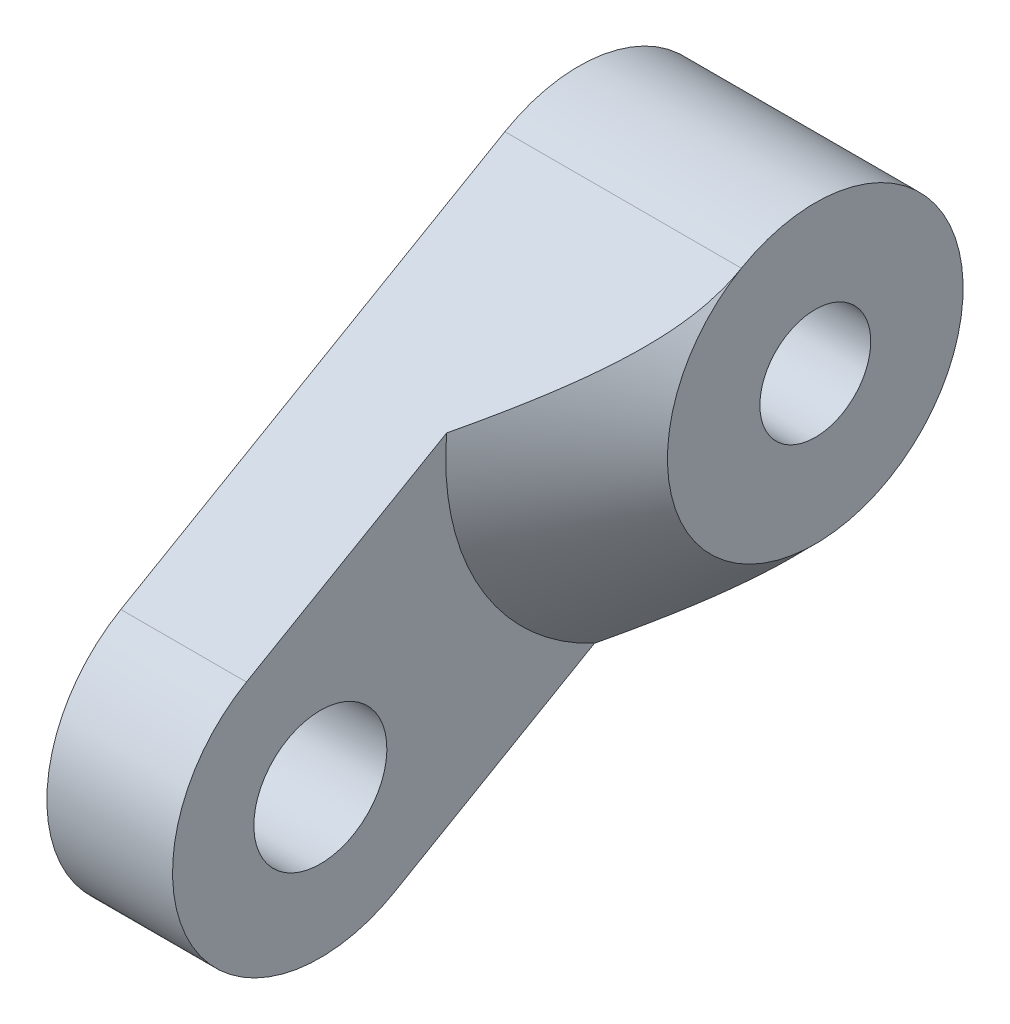
ISO-10303-21;
HEADER;
FILE_DESCRIPTION(('STEP AP214'),'2;1');
FILE_NAME('part.step','',(''),(''),'','','');
FILE_SCHEMA(('AUTOMOTIVE_DESIGN { 1 0 10303 214 1 1 1 1 }'));
ENDSEC;
DATA;
#1=APPLICATION_CONTEXT('core data for automotive mechanical design processes');
#2=APPLICATION_PROTOCOL_DEFINITION('international standard','automotive_design',2000,#1);
#3=PRODUCT_CONTEXT('',#1,'mechanical');
#4=PRODUCT('Part','Part','',(#3));
#5=PRODUCT_RELATED_PRODUCT_CATEGORY('part','',(#4));
#6=PRODUCT_DEFINITION_FORMATION('','',#4);
#7=PRODUCT_DEFINITION_CONTEXT('part definition',#1,'design');
#8=PRODUCT_DEFINITION('design','',#6,#7);
#9=PRODUCT_DEFINITION_SHAPE('','',#8);
#10=(LENGTH_UNIT() NAMED_UNIT(*) SI_UNIT(.MILLI.,.METRE.));
#11=(NAMED_UNIT(*) PLANE_ANGLE_UNIT() SI_UNIT($,.RADIAN.));
#12=(NAMED_UNIT(*) SI_UNIT($,.STERADIAN.) SOLID_ANGLE_UNIT());
#13=UNCERTAINTY_MEASURE_WITH_UNIT(LENGTH_MEASURE(1.E-05),#10,'distance_accuracy_value','');
#14=(GEOMETRIC_REPRESENTATION_CONTEXT(3) GLOBAL_UNCERTAINTY_ASSIGNED_CONTEXT((#13)) GLOBAL_UNIT_ASSIGNED_CONTEXT((#10,
#11,#12)) REPRESENTATION_CONTEXT('',''));
#15=CARTESIAN_POINT('',(0.,0.,0.));
#16=DIRECTION('',(0.,0.,1.));
#17=DIRECTION('',(1.,0.,0.));
#18=AXIS2_PLACEMENT_3D('',#15,#16,#17);
#19=CARTESIAN_POINT('',(4.15,-6.46410161513776,3.19615242270664));
#20=DIRECTION('',(0.,-0.866025403784439,-0.5));
#21=DIRECTION('',(0.,0.5,-0.866025403784439));
#22=AXIS2_PLACEMENT_3D('',#19,#20,#21);
#23=PLANE('',#22);
#24=DIRECTION('',(0.,-0.5,0.866025403784439));
#25=VECTOR('',#24,1.);
#26=CARTESIAN_POINT('',(0.75,-6.46410161513776,3.19615242270664));
#27=LINE('',#26,#25);
#28=CARTESIAN_POINT('',(0.75,-3.46410161513776,-2.));
#29=VERTEX_POINT('',#28);
#30=CARTESIAN_POINT('',(0.75,-9.46410161513775,8.39230484541327));
#31=VERTEX_POINT('',#30);
#32=EDGE_CURVE('E11',#29,#31,#27,.T.);
#33=ORIENTED_EDGE('',*,*,#32,.F.);
#34=DIRECTION('',(-1.,0.,0.));
#35=VECTOR('',#34,1.);
#36=CARTESIAN_POINT('',(4.15,-3.46410161513776,-2.));
#37=LINE('',#36,#35);
#38=CARTESIAN_POINT('',(7.15,-3.46410161513776,-2.));
#39=VERTEX_POINT('',#38);
#40=EDGE_CURVE('E25',#39,#29,#37,.T.);
#41=ORIENTED_EDGE('',*,*,#40,.F.);
#42=CARTESIAN_POINT('',(7.15,-3.46410161513776,-2.));
#43=CARTESIAN_POINT('',(7.15000495558701,-3.49486623155934,-1.94671412128246));
#44=CARTESIAN_POINT('',(7.14857959002426,-3.52562633311852,-1.89343606253598));
#45=CARTESIAN_POINT('',(7.14291488089547,-3.58707676963033,-1.78700078435024));
#46=CARTESIAN_POINT('',(7.13867600090148,-3.61776711524062,-1.73384354645137));
#47=CARTESIAN_POINT('',(7.12183357584904,-3.70952021507166,-1.57492251579206));
#48=CARTESIAN_POINT('',(7.10510382359968,-3.77040355086952,-1.4694694848559));
#49=CARTESIAN_POINT('',(7.06191323144653,-3.89016145493996,-1.26204271039794));
#50=CARTESIAN_POINT('',(7.03563065290435,-3.94905249284434,-1.16004044063707));
#51=CARTESIAN_POINT('',(6.97446412150058,-4.06571972542516,-0.957966866228639));
#52=CARTESIAN_POINT('',(6.93957603775054,-4.12349537027677,-0.857896513905586));
#53=CARTESIAN_POINT('',(6.81652768533448,-4.30593558143131,-0.541900798842337));
#54=CARTESIAN_POINT('',(6.71442729580135,-4.42826623517251,-0.330017891239472));
#55=CARTESIAN_POINT('',(6.5436956635312,-4.60745875664494,-0.0196473397128512));
#56=CARTESIAN_POINT('',(6.48378050620427,-4.66653398272327,0.082673953323447));
#57=CARTESIAN_POINT('',(6.35912771552204,-4.78340401266141,0.285098783058402));
#58=CARTESIAN_POINT('',(6.29439065330274,-4.84119896711567,0.3852025805943));
#59=CARTESIAN_POINT('',(6.15989513709493,-4.95659006769358,0.585065829536538));
#60=CARTESIAN_POINT('',(6.09007104952281,-5.01416690086764,0.684791829932926));
#61=CARTESIAN_POINT('',(5.94710484213548,-5.12828424598705,0.88244886970462));
#62=CARTESIAN_POINT('',(5.87396247737422,-5.18482468099441,0.980379775819403));
#63=CARTESIAN_POINT('',(5.65060065042847,-5.35298919867628,1.27164926447472));
#64=CARTESIAN_POINT('',(5.49631952911267,-5.46326287669468,1.46264887754008));
#65=CARTESIAN_POINT('',(5.14679422688582,-5.70416210306856,1.87989857712368));
#66=CARTESIAN_POINT('',(4.94979960853262,-5.83414640959704,2.10503800021761));
#67=CARTESIAN_POINT('',(4.65084729316104,-6.02559965898364,2.43664475542935));
#68=CARTESIAN_POINT('',(4.55170066814463,-6.08817734829258,2.54503249273271));
#69=CARTESIAN_POINT('',(4.35191118363988,-6.21271644217646,2.76074053086817));
#70=CARTESIAN_POINT('',(4.2512685697867,-6.27467794519802,2.86806100221486));
#71=CARTESIAN_POINT('',(4.15,-6.33638293840677,2.9749371855331));
#72=B_SPLINE_CURVE_WITH_KNOTS('',3,(#42,#43,#44,#45,#46,#47,#48,#49,#50,#51,#52,#53,#54,#55,#56,
#57,#58,#59,#60,#61,#62,#63,#64,#65,#66,#67,#68,#69,#70,#71),.UNSPECIFIED.,.F.,.F.,(4,2,2,2,2,2,
2,2,2,2,2,2,2,2,4),(0.,0.184553945235247,0.36907748976712,0.737296607836383,1.09897043484959,
1.46081821466597,2.25385660127688,2.65123732944293,3.048571064019,3.45251679835832,
3.85649239952769,4.66370127089406,5.64202919472325,6.12102582375514,6.59994465376307),.UNSPECIFIED.);
#73=CARTESIAN_POINT('',(4.15,-6.33638293840677,2.9749371855331));
#74=VERTEX_POINT('',#73);
#75=EDGE_CURVE('E107',#39,#74,#72,.T.);
#76=ORIENTED_EDGE('',*,*,#75,.T.);
#77=DIRECTION('',(0.,-0.5,0.866025403784439));
#78=VECTOR('',#77,1.);
#79=CARTESIAN_POINT('',(4.15,-6.46410161513776,3.19615242270664));
#80=LINE('',#79,#78);
#81=CARTESIAN_POINT('',(4.15,-9.46410161513775,8.39230484541327));
#82=VERTEX_POINT('',#81);
#83=EDGE_CURVE('E76',#74,#82,#80,.T.);
#84=ORIENTED_EDGE('',*,*,#83,.T.);
#85=DIRECTION('',(-1.,0.,0.));
#86=VECTOR('',#85,1.);
#87=CARTESIAN_POINT('',(4.15,-9.46410161513775,8.39230484541327));
#88=LINE('',#87,#86);
#89=EDGE_CURVE('E128',#82,#31,#88,.T.);
#90=ORIENTED_EDGE('',*,*,#89,.T.);
#91=EDGE_LOOP('',(#33,#41,#76,#84,#90));
#92=FACE_BOUND('',#91,.T.);
#93=ADVANCED_FACE('F17',(#92),#23,.T.);
#94=CARTESIAN_POINT('',(4.15,0.,0.));
#95=DIRECTION('',(-1.,0.,0.));
#96=DIRECTION('',(0.,1.,0.));
#97=AXIS2_PLACEMENT_3D('',#94,#95,#96);
#98=CYLINDRICAL_SURFACE('',#97,4.);
#99=DIRECTION('',(-1.,0.,0.));
#100=VECTOR('',#99,1.);
#101=CARTESIAN_POINT('',(4.15,3.46410161513776,2.));
#102=LINE('',#101,#100);
#103=CARTESIAN_POINT('',(7.15,3.46410161513776,2.));
#104=VERTEX_POINT('',#103);
#105=CARTESIAN_POINT('',(0.75,3.46410161513776,2.));
#106=VERTEX_POINT('',#105);
#107=EDGE_CURVE('E123',#104,#106,#102,.T.);
#108=ORIENTED_EDGE('',*,*,#107,.F.);
#109=CARTESIAN_POINT('',(7.15,0.,0.));
#110=DIRECTION('',(-1.,0.,0.));
#111=DIRECTION('',(0.,-1.,0.));
#112=AXIS2_PLACEMENT_3D('',#109,#110,#111);
#113=CIRCLE('',#112,4.);
#114=EDGE_CURVE('E117',#104,#39,#113,.T.);
#115=ORIENTED_EDGE('',*,*,#114,.T.);
#116=ORIENTED_EDGE('',*,*,#40,.T.);
#117=CARTESIAN_POINT('',(0.75,0.,0.));
#118=DIRECTION('',(-1.,0.,0.));
#119=DIRECTION('',(0.,-1.,0.));
#120=AXIS2_PLACEMENT_3D('',#117,#118,#119);
#121=CIRCLE('',#120,4.);
#122=EDGE_CURVE('E116',#106,#29,#121,.T.);
#123=ORIENTED_EDGE('',*,*,#122,.F.);
#124=EDGE_LOOP('',(#108,#115,#116,#123));
#125=FACE_BOUND('',#124,.T.);
#126=ADVANCED_FACE('F104',(#125),#98,.T.);
#127=CARTESIAN_POINT('',(4.15,0.464101615137759,7.19615242270663));
#128=DIRECTION('',(0.,-0.866025403784439,-0.5));
#129=DIRECTION('',(0.,0.5,-0.866025403784439));
#130=AXIS2_PLACEMENT_3D('',#127,#128,#129);
#131=PLANE('',#130);
#132=DIRECTION('',(0.,-0.5,0.866025403784439));
#133=VECTOR('',#132,1.);
#134=CARTESIAN_POINT('',(0.75,0.464101615137759,7.19615242270663));
#135=LINE('',#134,#133);
#136=CARTESIAN_POINT('',(0.75,-2.53589838486224,12.3923048454133));
#137=VERTEX_POINT('',#136);
#138=EDGE_CURVE('E121',#106,#137,#135,.T.);
#139=ORIENTED_EDGE('',*,*,#138,.T.);
#140=DIRECTION('',(-1.,0.,0.));
#141=VECTOR('',#140,1.);
#142=CARTESIAN_POINT('',(4.15,-2.53589838486224,12.3923048454133));
#143=LINE('',#142,#141);
#144=CARTESIAN_POINT('',(4.15,-2.53589838486224,12.3923048454133));
#145=VERTEX_POINT('',#144);
#146=EDGE_CURVE('E67',#145,#137,#143,.T.);
#147=ORIENTED_EDGE('',*,*,#146,.F.);
#148=DIRECTION('',(0.,-0.5,0.866025403784439));
#149=VECTOR('',#148,1.);
#150=CARTESIAN_POINT('',(4.15,0.464101615137759,7.19615242270663));
#151=LINE('',#150,#149);
#152=CARTESIAN_POINT('',(4.15,0.591820291868744,6.9749371855331));
#153=VERTEX_POINT('',#152);
#154=EDGE_CURVE('E59',#153,#145,#151,.T.);
#155=ORIENTED_EDGE('',*,*,#154,.F.);
#156=CARTESIAN_POINT('',(4.15,0.591820291868744,6.9749371855331));
#157=CARTESIAN_POINT('',(4.23605256002381,0.644252947240087,6.88412116245418));
#158=CARTESIAN_POINT('',(4.3216525822049,0.696871756449689,6.79298271146938));
#159=CARTESIAN_POINT('',(4.49179490065681,0.802540199503788,6.60995959934298));
#160=CARTESIAN_POINT('',(4.57633713276434,0.855589859163968,6.51807489348731));
#161=CARTESIAN_POINT('',(4.82838325490805,1.01562250935517,6.24089021248625));
#162=CARTESIAN_POINT('',(4.99404864307594,1.12333292367194,6.05433030238532));
#163=CARTESIAN_POINT('',(5.32451404872733,1.34519334697627,5.67005677703347));
#164=CARTESIAN_POINT('',(5.4890688771437,1.45943565697827,5.47218329173599));
#165=CARTESIAN_POINT('',(5.72801817653271,1.63346407328317,5.17075723273514));
#166=CARTESIAN_POINT('',(5.8063354141456,1.69190267307059,5.06953860878014));
#167=CARTESIAN_POINT('',(5.95976362474555,1.80982023999268,4.86529939176619));
#168=CARTESIAN_POINT('',(6.03487482280261,1.86929913368212,4.76227892591809));
#169=CARTESIAN_POINT('',(6.19665803249444,2.00217205891702,4.53213626846094));
#170=CARTESIAN_POINT('',(6.28241320367156,2.07584737132062,4.4045268841144));
#171=CARTESIAN_POINT('',(6.44648195435648,2.22528296800435,4.14569683819879));
#172=CARTESIAN_POINT('',(6.52479382535671,2.30104372584819,4.01447535639336));
#173=CARTESIAN_POINT('',(6.67067411933917,2.45388391292442,3.74974838693898));
#174=CARTESIAN_POINT('',(6.73837278708093,2.53093193482904,3.61629729837751));
#175=CARTESIAN_POINT('',(6.86140872504655,2.68746123323993,3.34518060065673));
#176=CARTESIAN_POINT('',(6.91675333512312,2.76694103287589,3.20751754951185));
#177=CARTESIAN_POINT('',(6.99350646273605,2.8972158800099,2.98187489532748));
#178=CARTESIAN_POINT('',(7.01978283720333,2.9472958870335,2.8951337787192));
#179=CARTESIAN_POINT('',(7.06561452862172,3.04821012025961,2.72034519956472));
#180=CARTESIAN_POINT('',(7.08517221362876,3.09904407412405,2.63229820872189));
#181=CARTESIAN_POINT('',(7.11710763540426,3.2020481802109,2.45388986359126));
#182=CARTESIAN_POINT('',(7.12937522231801,3.25422698199496,2.36351352782321));
#183=CARTESIAN_POINT('',(7.1458552509883,3.3589658169743,2.18210054411342));
#184=CARTESIAN_POINT('',(7.15005744958729,3.41152624996931,2.09106320369823));
#185=CARTESIAN_POINT('',(7.15,3.46410161513776,2.));
#186=B_SPLINE_CURVE_WITH_KNOTS('',3,(#156,#157,#158,#159,#160,#161,#162,#163,#164,#165,#166,
#167,#168,#169,#170,#171,#172,#173,#174,#175,#176,#177,#178,#179,#180,#181,#182,#183,#184,#185),
.UNSPECIFIED.,.F.,.F.,(4,2,2,2,2,2,2,2,2,2,2,2,2,2,4),(0.,0.40695860525474,0.813941777229557,
1.62912342552435,2.47360910771078,2.89563973799894,3.31764069205107,3.8289378359389,
4.34035205908066,4.84489295952386,5.34913329707893,5.65958632230917,5.96992981334819,
6.28485049477084,6.60017086596033),.UNSPECIFIED.);
#187=EDGE_CURVE('E64',#153,#104,#186,.T.);
#188=ORIENTED_EDGE('',*,*,#187,.T.);
#189=ORIENTED_EDGE('',*,*,#107,.T.);
#190=EDGE_LOOP('',(#139,#147,#155,#188,#189));
#191=FACE_BOUND('',#190,.T.);
#192=ADVANCED_FACE('F61',(#191),#131,.F.);
#193=CARTESIAN_POINT('',(4.15,-6.,10.3923048454133));
#194=DIRECTION('',(-1.,0.,0.));
#195=DIRECTION('',(0.,1.,0.));
#196=AXIS2_PLACEMENT_3D('',#193,#194,#195);
#197=CYLINDRICAL_SURFACE('',#196,4.);
#198=CARTESIAN_POINT('',(0.75,-6.,10.3923048454133));
#199=DIRECTION('',(-1.,0.,0.));
#200=DIRECTION('',(0.,-1.,0.));
#201=AXIS2_PLACEMENT_3D('',#198,#199,#200);
#202=CIRCLE('',#201,4.);
#203=EDGE_CURVE('E86',#31,#137,#202,.T.);
#204=ORIENTED_EDGE('',*,*,#203,.F.);
#205=ORIENTED_EDGE('',*,*,#89,.F.);
#206=CARTESIAN_POINT('',(4.15,-6.,10.3923048454133));
#207=DIRECTION('',(-1.,0.,0.));
#208=DIRECTION('',(0.,-1.,0.));
#209=AXIS2_PLACEMENT_3D('',#206,#207,#208);
#210=CIRCLE('',#209,4.);
#211=EDGE_CURVE('E89',#82,#145,#210,.T.);
#212=ORIENTED_EDGE('',*,*,#211,.T.);
#213=ORIENTED_EDGE('',*,*,#146,.T.);
#214=EDGE_LOOP('',(#204,#205,#212,#213));
#215=FACE_BOUND('',#214,.T.);
#216=ADVANCED_FACE('F132',(#215),#197,.T.);
#217=CARTESIAN_POINT('',(4.15,5.,2.24428235379889));
#218=DIRECTION('',(1.,0.,0.));
#219=DIRECTION('',(0.,0.,-1.));
#220=AXIS2_PLACEMENT_3D('',#217,#218,#219);
#221=PLANE('',#220);
#222=CARTESIAN_POINT('',(4.15,-6.,10.3923048454133));
#223=DIRECTION('',(-1.,0.,0.));
#224=DIRECTION('',(0.,1.,0.));
#225=AXIS2_PLACEMENT_3D('',#222,#223,#224);
#226=CIRCLE('',#225,1.8);
#227=CARTESIAN_POINT('',(4.15,-4.2,10.3923048454133));
#228=VERTEX_POINT('',#227);
#229=EDGE_CURVE('E79',#228,#228,#226,.T.);
#230=ORIENTED_EDGE('',*,*,#229,.T.);
#231=EDGE_LOOP('',(#230));
#232=FACE_BOUND('',#231,.T.);
#233=ORIENTED_EDGE('',*,*,#83,.F.);
#234=CARTESIAN_POINT('',(4.15,0.,0.));
#235=DIRECTION('',(1.,0.,0.));
#236=DIRECTION('',(0.,-1.,0.));
#237=AXIS2_PLACEMENT_3D('',#234,#235,#236);
#238=CIRCLE('',#237,7.);
#239=EDGE_CURVE('E74',#74,#153,#238,.F.);
#240=ORIENTED_EDGE('',*,*,#239,.T.);
#241=ORIENTED_EDGE('',*,*,#154,.T.);
#242=ORIENTED_EDGE('',*,*,#211,.F.);
#243=EDGE_LOOP('',(#233,#240,#241,#242));
#244=FACE_BOUND('',#243,.T.);
#245=ADVANCED_FACE('F75',(#232,#244),#221,.T.);
#246=CARTESIAN_POINT('',(0.75,5.,2.24428235379889));
#247=DIRECTION('',(1.,0.,0.));
#248=DIRECTION('',(0.,0.,-1.));
#249=AXIS2_PLACEMENT_3D('',#246,#247,#248);
#250=PLANE('',#249);
#251=CARTESIAN_POINT('',(0.75,0.,0.));
#252=DIRECTION('',(1.,0.,0.));
#253=DIRECTION('',(0.,-1.,0.));
#254=AXIS2_PLACEMENT_3D('',#251,#252,#253);
#255=CIRCLE('',#254,2.7);
#256=CARTESIAN_POINT('',(0.75,-2.7,0.));
#257=VERTEX_POINT('',#256);
#258=EDGE_CURVE('E80',#257,#257,#255,.T.);
#259=ORIENTED_EDGE('',*,*,#258,.T.);
#260=EDGE_LOOP('',(#259));
#261=FACE_BOUND('',#260,.T.);
#262=CARTESIAN_POINT('',(0.75,-6.,10.3923048454133));
#263=DIRECTION('',(1.,0.,0.));
#264=DIRECTION('',(0.,-1.,0.));
#265=AXIS2_PLACEMENT_3D('',#262,#263,#264);
#266=CIRCLE('',#265,1.8);
#267=CARTESIAN_POINT('',(0.75,-7.8,10.3923048454133));
#268=VERTEX_POINT('',#267);
#269=EDGE_CURVE('E138',#268,#268,#266,.F.);
#270=ORIENTED_EDGE('',*,*,#269,.F.);
#271=EDGE_LOOP('',(#270));
#272=FACE_BOUND('',#271,.T.);
#273=ORIENTED_EDGE('',*,*,#32,.T.);
#274=ORIENTED_EDGE('',*,*,#203,.T.);
#275=ORIENTED_EDGE('',*,*,#138,.F.);
#276=ORIENTED_EDGE('',*,*,#122,.T.);
#277=EDGE_LOOP('',(#273,#274,#275,#276));
#278=FACE_BOUND('',#277,.T.);
#279=ADVANCED_FACE('F120',(#261,#272,#278),#250,.F.);
#280=CARTESIAN_POINT('',(4.15,-6.,10.3923048454133));
#281=DIRECTION('',(-1.,0.,0.));
#282=DIRECTION('',(0.,1.,0.));
#283=AXIS2_PLACEMENT_3D('',#280,#281,#282);
#284=CYLINDRICAL_SURFACE('',#283,1.8);
#285=ORIENTED_EDGE('',*,*,#229,.F.);
#286=EDGE_LOOP('',(#285));
#287=FACE_BOUND('',#286,.T.);
#288=ORIENTED_EDGE('',*,*,#269,.T.);
#289=EDGE_LOOP('',(#288));
#290=FACE_BOUND('',#289,.T.);
#291=ADVANCED_FACE('F164',(#287,#290),#284,.F.);
#292=CARTESIAN_POINT('',(0.75,0.,0.));
#293=DIRECTION('',(1.,0.,0.));
#294=DIRECTION('',(0.,-1.,0.));
#295=AXIS2_PLACEMENT_3D('',#292,#293,#294);
#296=CYLINDRICAL_SURFACE('',#295,1.5);
#297=CARTESIAN_POINT('',(3.55,0.,0.));
#298=DIRECTION('',(1.,0.,0.));
#299=DIRECTION('',(0.,-1.,0.));
#300=AXIS2_PLACEMENT_3D('',#297,#298,#299);
#301=CIRCLE('',#300,1.5);
#302=CARTESIAN_POINT('',(3.55,-1.5,0.));
#303=VERTEX_POINT('',#302);
#304=EDGE_CURVE('E141',#303,#303,#301,.T.);
#305=ORIENTED_EDGE('',*,*,#304,.F.);
#306=EDGE_LOOP('',(#305));
#307=FACE_BOUND('',#306,.T.);
#308=CARTESIAN_POINT('',(7.15,0.,0.));
#309=DIRECTION('',(1.,0.,0.));
#310=DIRECTION('',(0.,-1.,0.));
#311=AXIS2_PLACEMENT_3D('',#308,#309,#310);
#312=CIRCLE('',#311,1.5);
#313=CARTESIAN_POINT('',(7.15,-1.5,0.));
#314=VERTEX_POINT('',#313);
#315=EDGE_CURVE('E144',#314,#314,#312,.F.);
#316=ORIENTED_EDGE('',*,*,#315,.F.);
#317=EDGE_LOOP('',(#316));
#318=FACE_BOUND('',#317,.T.);
#319=ADVANCED_FACE('F169',(#307,#318),#296,.F.);
#320=CARTESIAN_POINT('',(3.55,0.,-2.2));
#321=DIRECTION('',(-1.,0.,0.));
#322=DIRECTION('',(0.,1.,0.));
#323=AXIS2_PLACEMENT_3D('',#320,#321,#322);
#324=PLANE('',#323);
#325=ORIENTED_EDGE('',*,*,#304,.T.);
#326=EDGE_LOOP('',(#325));
#327=FACE_BOUND('',#326,.T.);
#328=CARTESIAN_POINT('',(3.55,0.,0.));
#329=DIRECTION('',(1.,0.,0.));
#330=DIRECTION('',(0.,-1.,0.));
#331=AXIS2_PLACEMENT_3D('',#328,#329,#330);
#332=CIRCLE('',#331,2.2);
#333=CARTESIAN_POINT('',(3.55,-2.2,0.));
#334=VERTEX_POINT('',#333);
#335=EDGE_CURVE('E147',#334,#334,#332,.T.);
#336=ORIENTED_EDGE('',*,*,#335,.F.);
#337=EDGE_LOOP('',(#336));
#338=FACE_BOUND('',#337,.T.);
#339=ADVANCED_FACE('F176',(#327,#338),#324,.T.);
#340=CARTESIAN_POINT('',(0.75,0.,0.));
#341=DIRECTION('',(1.,0.,0.));
#342=DIRECTION('',(0.,-1.,0.));
#343=AXIS2_PLACEMENT_3D('',#340,#341,#342);
#344=CYLINDRICAL_SURFACE('',#343,2.2);
#345=CARTESIAN_POINT('',(1.25,0.,0.));
#346=DIRECTION('',(1.,0.,0.));
#347=DIRECTION('',(0.,-1.,0.));
#348=AXIS2_PLACEMENT_3D('',#345,#346,#347);
#349=CIRCLE('',#348,2.2);
#350=CARTESIAN_POINT('',(1.25,-2.2,0.));
#351=VERTEX_POINT('',#350);
#352=EDGE_CURVE('E127',#351,#351,#349,.F.);
#353=ORIENTED_EDGE('',*,*,#352,.T.);
#354=EDGE_LOOP('',(#353));
#355=FACE_BOUND('',#354,.T.);
#356=ORIENTED_EDGE('',*,*,#335,.T.);
#357=EDGE_LOOP('',(#356));
#358=FACE_BOUND('',#357,.T.);
#359=ADVANCED_FACE('F153',(#355,#358),#344,.F.);
#360=CARTESIAN_POINT('',(0.75,0.,0.));
#361=DIRECTION('',(-1.,0.,0.));
#362=DIRECTION('',(0.,1.,0.));
#363=AXIS2_PLACEMENT_3D('',#360,#361,#362);
#364=CONICAL_SURFACE('',#363,2.7,0.785398163397449);
#365=ORIENTED_EDGE('',*,*,#352,.F.);
#366=EDGE_LOOP('',(#365));
#367=FACE_BOUND('',#366,.T.);
#368=ORIENTED_EDGE('',*,*,#258,.F.);
#369=EDGE_LOOP('',(#368));
#370=FACE_BOUND('',#369,.T.);
#371=ADVANCED_FACE('F156',(#367,#370),#364,.F.);
#372=CARTESIAN_POINT('',(7.15,-3.,5.19615242270663));
#373=DIRECTION('',(1.,0.,0.));
#374=DIRECTION('',(0.,0.,-1.));
#375=AXIS2_PLACEMENT_3D('',#372,#373,#374);
#376=PLANE('',#375);
#377=ORIENTED_EDGE('',*,*,#315,.T.);
#378=EDGE_LOOP('',(#377));
#379=FACE_BOUND('',#378,.T.);
#380=ORIENTED_EDGE('',*,*,#114,.F.);
#381=EDGE_CURVE('E85',#39,#104,#113,.T.);
#382=ORIENTED_EDGE('',*,*,#381,.F.);
#383=EDGE_LOOP('',(#380,#382));
#384=FACE_BOUND('',#383,.T.);
#385=ADVANCED_FACE('F103',(#379,#384),#376,.T.);
#386=CARTESIAN_POINT('',(4.15,0.,0.));
#387=DIRECTION('',(-1.,0.,0.));
#388=DIRECTION('',(0.,1.,0.));
#389=AXIS2_PLACEMENT_3D('',#386,#387,#388);
#390=CONICAL_SURFACE('',#389,7.,0.785398163397449);
#391=ORIENTED_EDGE('',*,*,#75,.F.);
#392=ORIENTED_EDGE('',*,*,#381,.T.);
#393=ORIENTED_EDGE('',*,*,#187,.F.);
#394=ORIENTED_EDGE('',*,*,#239,.F.);
#395=EDGE_LOOP('',(#391,#392,#393,#394));
#396=FACE_BOUND('',#395,.T.);
#397=ADVANCED_FACE('F83',(#396),#390,.T.);
#398=CLOSED_SHELL('',(#93,#126,#192,#216,#245,#279,#291,#319,#339,#359,#371,#385,#397));
#399=MANIFOLD_SOLID_BREP('B1',#398);
#400=ADVANCED_BREP_SHAPE_REPRESENTATION('',(#18,#399),#14);
#401=SHAPE_DEFINITION_REPRESENTATION(#9,#400);
ENDSEC;
END-ISO-10303-21;
